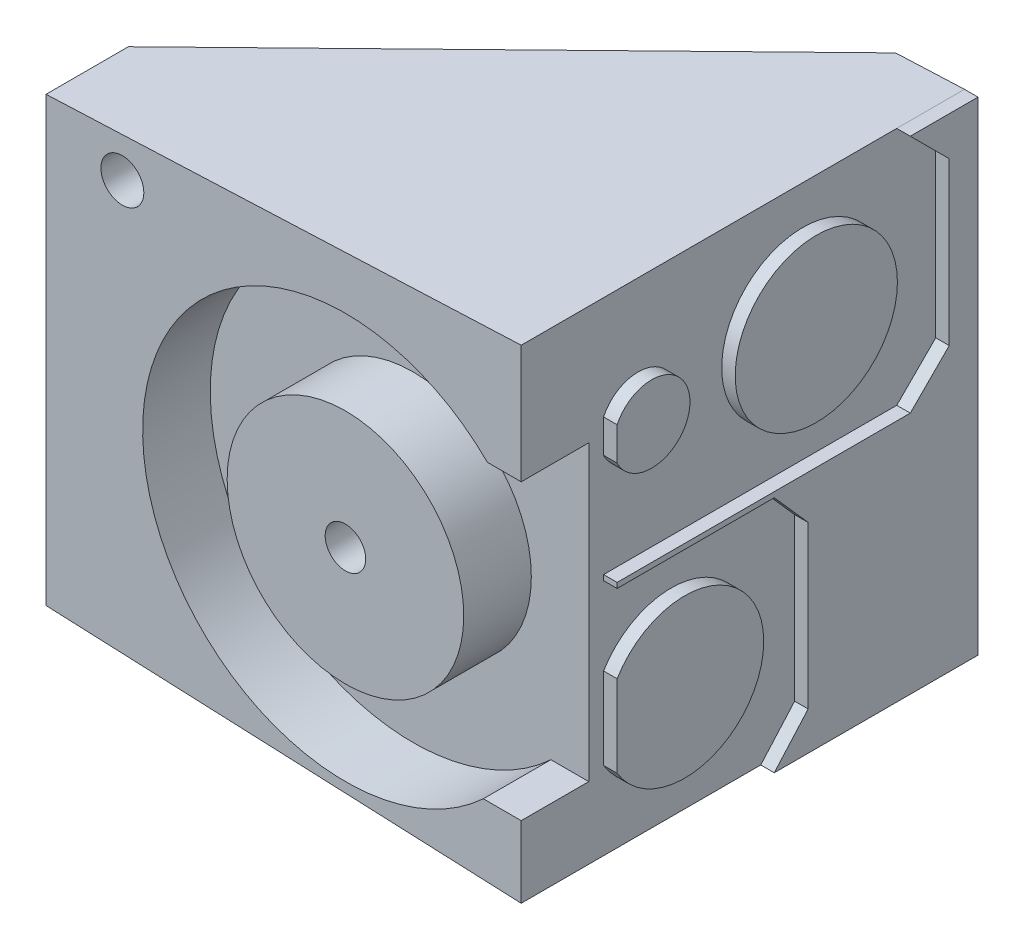
ISO-10303-21;
HEADER;
FILE_DESCRIPTION(('STEP AP214'),'2;1');
FILE_NAME('part.step','',(''),(''),'','','');
FILE_SCHEMA(('AUTOMOTIVE_DESIGN { 1 0 10303 214 1 1 1 1 }'));
ENDSEC;
DATA;
#1=APPLICATION_CONTEXT('core data for automotive mechanical design processes');
#2=APPLICATION_PROTOCOL_DEFINITION('international standard','automotive_design',2000,#1);
#3=PRODUCT_CONTEXT('',#1,'mechanical');
#4=PRODUCT('Part','Part','',(#3));
#5=PRODUCT_RELATED_PRODUCT_CATEGORY('part','',(#4));
#6=PRODUCT_DEFINITION_FORMATION('','',#4);
#7=PRODUCT_DEFINITION_CONTEXT('part definition',#1,'design');
#8=PRODUCT_DEFINITION('design','',#6,#7);
#9=PRODUCT_DEFINITION_SHAPE('','',#8);
#10=(LENGTH_UNIT() NAMED_UNIT(*) SI_UNIT(.MILLI.,.METRE.));
#11=(NAMED_UNIT(*) PLANE_ANGLE_UNIT() SI_UNIT($,.RADIAN.));
#12=(NAMED_UNIT(*) SI_UNIT($,.STERADIAN.) SOLID_ANGLE_UNIT());
#13=UNCERTAINTY_MEASURE_WITH_UNIT(LENGTH_MEASURE(1.E-05),#10,'distance_accuracy_value','');
#14=(GEOMETRIC_REPRESENTATION_CONTEXT(3) GLOBAL_UNCERTAINTY_ASSIGNED_CONTEXT((#13)) GLOBAL_UNIT_ASSIGNED_CONTEXT((#10,
#11,#12)) REPRESENTATION_CONTEXT('',''));
#15=CARTESIAN_POINT('',(0.,0.,0.));
#16=DIRECTION('',(0.,0.,1.));
#17=DIRECTION('',(1.,0.,0.));
#18=AXIS2_PLACEMENT_3D('',#15,#16,#17);
#19=CARTESIAN_POINT('',(23.958,-35.75,-32.79));
#20=DIRECTION('',(0.664090490965393,0.,0.74765220511234));
#21=DIRECTION('',(0.74765220511234,0.,-0.664090490965393));
#22=AXIS2_PLACEMENT_3D('',#19,#20,#21);
#23=PLANE('',#22);
#24=DIRECTION('',(0.,1.,0.));
#25=VECTOR('',#24,1.);
#26=CARTESIAN_POINT('',(-36.15,-35.75,20.6));
#27=LINE('',#26,#25);
#28=CARTESIAN_POINT('',(-36.15,31.,20.6));
#29=VERTEX_POINT('',#28);
#30=CARTESIAN_POINT('',(-36.15,32.75,20.6));
#31=VERTEX_POINT('',#30);
#32=EDGE_CURVE('E310',#29,#31,#27,.T.);
#33=ORIENTED_EDGE('',*,*,#32,.T.);
#34=DIRECTION('',(0.747271955042155,0.0318892726191531,-0.663752739730163));
#35=VECTOR('',#34,1.);
#36=CARTESIAN_POINT('',(22.2645224315262,35.2427961208333,-31.2857947797163));
#37=LINE('',#36,#35);
#38=CARTESIAN_POINT('',(23.958,35.3150640113798,-32.79));
#39=VERTEX_POINT('',#38);
#40=EDGE_CURVE('E287',#31,#39,#37,.T.);
#41=ORIENTED_EDGE('',*,*,#40,.T.);
#42=DIRECTION('',(0.,1.,0.));
#43=VECTOR('',#42,1.);
#44=CARTESIAN_POINT('',(23.958,-35.75,-32.79));
#45=LINE('',#44,#43);
#46=CARTESIAN_POINT('',(23.958,31.,-32.79));
#47=VERTEX_POINT('',#46);
#48=EDGE_CURVE('E259',#47,#39,#45,.T.);
#49=ORIENTED_EDGE('',*,*,#48,.F.);
#50=DIRECTION('',(-0.74765220511234,0.,0.664090490965393));
#51=VECTOR('',#50,1.);
#52=CARTESIAN_POINT('',(-36.15,31.,20.6));
#53=LINE('',#52,#51);
#54=EDGE_CURVE('E280',#47,#29,#53,.T.);
#55=ORIENTED_EDGE('',*,*,#54,.T.);
#56=EDGE_LOOP('',(#33,#41,#49,#55));
#57=FACE_BOUND('',#56,.T.);
#58=ADVANCED_FACE('F59',(#57),#23,.F.);
#59=CARTESIAN_POINT('',(36.15,35.75,32.79));
#60=DIRECTION('',(-1.,0.,0.));
#61=DIRECTION('',(0.,0.,1.));
#62=AXIS2_PLACEMENT_3D('',#59,#60,#61);
#63=PLANE('',#62);
#64=DIRECTION('',(0.,-0.707106781186548,-0.707106781186548));
#65=VECTOR('',#64,1.);
#66=CARTESIAN_POINT('',(36.15,29.26,-29.26));
#67=LINE('',#66,#65);
#68=CARTESIAN_POINT('',(36.15,35.75,-22.77));
#69=VERTEX_POINT('',#68);
#70=CARTESIAN_POINT('',(36.15,29.985,-28.535));
#71=VERTEX_POINT('',#70);
#72=EDGE_CURVE('E410',#69,#71,#67,.T.);
#73=ORIENTED_EDGE('',*,*,#72,.T.);
#74=DIRECTION('',(0.,-1.,0.));
#75=VECTOR('',#74,1.);
#76=CARTESIAN_POINT('',(36.15,0.,-28.535));
#77=LINE('',#76,#75);
#78=CARTESIAN_POINT('',(36.15,6.035,-28.535));
#79=VERTEX_POINT('',#78);
#80=EDGE_CURVE('E431',#71,#79,#77,.T.);
#81=ORIENTED_EDGE('',*,*,#80,.T.);
#82=DIRECTION('',(0.,-0.707106781186547,0.707106781186548));
#83=VECTOR('',#82,1.);
#84=CARTESIAN_POINT('',(36.15,-11.25,-11.25));
#85=LINE('',#84,#83);
#86=CARTESIAN_POINT('',(36.15,0.270000000000012,-22.77));
#87=VERTEX_POINT('',#86);
#88=EDGE_CURVE('E428',#79,#87,#85,.T.);
#89=ORIENTED_EDGE('',*,*,#88,.T.);
#90=DIRECTION('',(0.,0.,1.));
#91=VECTOR('',#90,1.);
#92=CARTESIAN_POINT('',(36.15,0.270000000000007,0.));
#93=LINE('',#92,#91);
#94=CARTESIAN_POINT('',(36.15,0.270000000000007,20.6));
#95=VERTEX_POINT('',#94);
#96=EDGE_CURVE('E425',#87,#95,#93,.T.);
#97=ORIENTED_EDGE('',*,*,#96,.T.);
#98=DIRECTION('',(0.,-1.,0.));
#99=VECTOR('',#98,1.);
#100=CARTESIAN_POINT('',(36.15,0.,20.6));
#101=LINE('',#100,#99);
#102=CARTESIAN_POINT('',(36.15,-0.509999999999999,20.6));
#103=VERTEX_POINT('',#102);
#104=EDGE_CURVE('E403',#95,#103,#101,.T.);
#105=ORIENTED_EDGE('',*,*,#104,.T.);
#106=DIRECTION('',(0.,0.,-1.));
#107=VECTOR('',#106,1.);
#108=CARTESIAN_POINT('',(36.15,-0.509999999999999,0.));
#109=LINE('',#108,#107);
#110=CARTESIAN_POINT('',(36.15,-0.509999999999999,-2.65));
#111=VERTEX_POINT('',#110);
#112=EDGE_CURVE('E422',#103,#111,#109,.T.);
#113=ORIENTED_EDGE('',*,*,#112,.T.);
#114=DIRECTION('',(0.,-0.74937483770306,-0.662146020615931));
#115=VECTOR('',#114,1.);
#116=CARTESIAN_POINT('',(36.15,1.09131520201226,-1.23508127652885));
#117=LINE('',#116,#115);
#118=CARTESIAN_POINT('',(36.15,-6.18,-7.66));
#119=VERTEX_POINT('',#118);
#120=EDGE_CURVE('E419',#111,#119,#117,.T.);
#121=ORIENTED_EDGE('',*,*,#120,.T.);
#122=DIRECTION('',(0.,-1.,0.));
#123=VECTOR('',#122,1.);
#124=CARTESIAN_POINT('',(36.15,0.,-7.66));
#125=LINE('',#124,#123);
#126=CARTESIAN_POINT('',(36.15,-30.08,-7.66));
#127=VERTEX_POINT('',#126);
#128=EDGE_CURVE('E416',#119,#127,#125,.T.);
#129=ORIENTED_EDGE('',*,*,#128,.T.);
#130=DIRECTION('',(0.,-0.74937483770306,0.662146020615931));
#131=VECTOR('',#130,1.);
#132=CARTESIAN_POINT('',(36.15,-16.9890536079233,-19.2271325263323));
#133=LINE('',#132,#131);
#134=CARTESIAN_POINT('',(36.15,-35.75,-2.65));
#135=VERTEX_POINT('',#134);
#136=EDGE_CURVE('E413',#127,#135,#133,.T.);
#137=ORIENTED_EDGE('',*,*,#136,.T.);
#138=DIRECTION('',(0.,0.,-1.));
#139=VECTOR('',#138,1.);
#140=CARTESIAN_POINT('',(36.15,-35.75,32.79));
#141=LINE('',#140,#139);
#142=CARTESIAN_POINT('',(36.15,-35.75,-32.79));
#143=VERTEX_POINT('',#142);
#144=EDGE_CURVE('E273',#135,#143,#141,.T.);
#145=ORIENTED_EDGE('',*,*,#144,.T.);
#146=DIRECTION('',(0.,-1.,0.));
#147=VECTOR('',#146,1.);
#148=CARTESIAN_POINT('',(36.15,35.75,-32.79));
#149=LINE('',#148,#147);
#150=CARTESIAN_POINT('',(36.15,35.75,-32.79));
#151=VERTEX_POINT('',#150);
#152=EDGE_CURVE('E67',#151,#143,#149,.T.);
#153=ORIENTED_EDGE('',*,*,#152,.F.);
#154=DIRECTION('',(0.,0.,-1.));
#155=VECTOR('',#154,1.);
#156=CARTESIAN_POINT('',(36.15,35.75,32.79));
#157=LINE('',#156,#155);
#158=EDGE_CURVE('E264',#69,#151,#157,.T.);
#159=ORIENTED_EDGE('',*,*,#158,.F.);
#160=EDGE_LOOP('',(#73,#81,#89,#97,#105,#113,#121,#129,#137,#145,#153,#159));
#161=FACE_BOUND('',#160,.T.);
#162=ADVANCED_FACE('F61',(#161),#63,.F.);
#163=CARTESIAN_POINT('',(-36.15,35.75,32.79));
#164=DIRECTION('',(0.,0.,-1.));
#165=DIRECTION('',(-1.,0.,0.));
#166=AXIS2_PLACEMENT_3D('',#163,#164,#165);
#167=PLANE('',#166);
#168=CARTESIAN_POINT('',(-24.8529045409058,27.3656410168728,32.79));
#169=DIRECTION('',(0.,0.,1.));
#170=DIRECTION('',(1.,0.,0.));
#171=AXIS2_PLACEMENT_3D('',#168,#169,#170);
#172=CIRCLE('',#171,3.175);
#173=CARTESIAN_POINT('',(-21.6779045409058,27.3656410168728,32.79));
#174=VERTEX_POINT('',#173);
#175=EDGE_CURVE('E281',#174,#174,#172,.T.);
#176=ORIENTED_EDGE('',*,*,#175,.F.);
#177=EDGE_LOOP('',(#176));
#178=FACE_BOUND('',#177,.T.);
#179=DIRECTION('',(0.,-1.,0.));
#180=VECTOR('',#179,1.);
#181=CARTESIAN_POINT('',(34.15,0.,32.79));
#182=LINE('',#181,#180);
#183=CARTESIAN_POINT('',(34.15,35.75,32.79));
#184=VERTEX_POINT('',#183);
#185=CARTESIAN_POINT('',(34.15,18.25,32.79));
#186=VERTEX_POINT('',#185);
#187=EDGE_CURVE('E375',#184,#186,#182,.T.);
#188=ORIENTED_EDGE('',*,*,#187,.F.);
#189=DIRECTION('',(0.999090695813441,0.0426354493234755,0.));
#190=VECTOR('',#189,1.);
#191=CARTESIAN_POINT('',(34.15,35.75,32.79));
#192=LINE('',#191,#190);
#193=CARTESIAN_POINT('',(-36.15,32.75,32.79));
#194=VERTEX_POINT('',#193);
#195=EDGE_CURVE('E260',#194,#184,#192,.T.);
#196=ORIENTED_EDGE('',*,*,#195,.F.);
#197=DIRECTION('',(0.,-1.,0.));
#198=VECTOR('',#197,1.);
#199=CARTESIAN_POINT('',(-36.15,35.75,32.79));
#200=LINE('',#199,#198);
#201=CARTESIAN_POINT('',(-36.15,-32.75,32.79));
#202=VERTEX_POINT('',#201);
#203=EDGE_CURVE('E265',#194,#202,#200,.T.);
#204=ORIENTED_EDGE('',*,*,#203,.T.);
#205=DIRECTION('',(-0.999090695813441,0.0426354493234755,0.));
#206=VECTOR('',#205,1.);
#207=CARTESIAN_POINT('',(34.15,-35.75,32.79));
#208=LINE('',#207,#206);
#209=CARTESIAN_POINT('',(34.15,-35.75,32.79));
#210=VERTEX_POINT('',#209);
#211=EDGE_CURVE('E545',#210,#202,#208,.T.);
#212=ORIENTED_EDGE('',*,*,#211,.F.);
#213=CARTESIAN_POINT('',(34.15,-25.16,32.79));
#214=VERTEX_POINT('',#213);
#215=EDGE_CURVE('E374',#214,#210,#182,.T.);
#216=ORIENTED_EDGE('',*,*,#215,.F.);
#217=DIRECTION('',(-1.,0.,0.));
#218=VECTOR('',#217,1.);
#219=CARTESIAN_POINT('',(0.,-25.16,32.79));
#220=LINE('',#219,#218);
#221=CARTESIAN_POINT('',(28.5460780543712,-25.16,32.79));
#222=VERTEX_POINT('',#221);
#223=EDGE_CURVE('E329',#214,#222,#220,.T.);
#224=ORIENTED_EDGE('',*,*,#223,.T.);
#225=CARTESIAN_POINT('',(8.15000000000001,-3.16,32.79));
#226=DIRECTION('',(0.,0.,1.));
#227=DIRECTION('',(1.,0.,0.));
#228=AXIS2_PLACEMENT_3D('',#225,#226,#227);
#229=CIRCLE('',#228,30.);
#230=CARTESIAN_POINT('',(29.1645639973805,18.25,32.79));
#231=VERTEX_POINT('',#230);
#232=EDGE_CURVE('E346',#231,#222,#229,.T.);
#233=ORIENTED_EDGE('',*,*,#232,.F.);
#234=DIRECTION('',(-1.,0.,0.));
#235=VECTOR('',#234,1.);
#236=CARTESIAN_POINT('',(0.,18.25,32.79));
#237=LINE('',#236,#235);
#238=EDGE_CURVE('E343',#186,#231,#237,.T.);
#239=ORIENTED_EDGE('',*,*,#238,.F.);
#240=EDGE_LOOP('',(#188,#196,#204,#212,#216,#224,#233,#239));
#241=FACE_BOUND('',#240,.T.);
#242=ADVANCED_FACE('F498',(#178,#241),#167,.F.);
#243=CARTESIAN_POINT('',(0.,35.75,0.));
#244=DIRECTION('',(0.,-1.,0.));
#245=DIRECTION('',(0.,0.,-1.));
#246=AXIS2_PLACEMENT_3D('',#243,#244,#245);
#247=PLANE('',#246);
#248=DIRECTION('',(-1.,0.,0.));
#249=VECTOR('',#248,1.);
#250=CARTESIAN_POINT('',(-36.15,35.75,-32.79));
#251=LINE('',#250,#249);
#252=CARTESIAN_POINT('',(34.15,35.75,-32.79));
#253=VERTEX_POINT('',#252);
#254=EDGE_CURVE('E255',#151,#253,#251,.T.);
#255=ORIENTED_EDGE('',*,*,#254,.T.);
#256=DIRECTION('',(0.,0.,1.));
#257=VECTOR('',#256,1.);
#258=CARTESIAN_POINT('',(34.15,35.75,-32.79));
#259=LINE('',#258,#257);
#260=CARTESIAN_POINT('',(34.15,35.75,-22.77));
#261=VERTEX_POINT('',#260);
#262=EDGE_CURVE('E237',#253,#261,#259,.T.);
#263=ORIENTED_EDGE('',*,*,#262,.T.);
#264=DIRECTION('',(1.,0.,0.));
#265=VECTOR('',#264,1.);
#266=CARTESIAN_POINT('',(34.15,35.75,-22.77));
#267=LINE('',#266,#265);
#268=EDGE_CURVE('E454',#261,#69,#267,.T.);
#269=ORIENTED_EDGE('',*,*,#268,.T.);
#270=ORIENTED_EDGE('',*,*,#158,.T.);
#271=EDGE_LOOP('',(#255,#263,#269,#270));
#272=FACE_BOUND('',#271,.T.);
#273=ADVANCED_FACE('F262',(#272),#247,.F.);
#274=CARTESIAN_POINT('',(0.,-35.75,0.));
#275=DIRECTION('',(0.,-1.,0.));
#276=DIRECTION('',(0.,0.,-1.));
#277=AXIS2_PLACEMENT_3D('',#274,#275,#276);
#278=PLANE('',#277);
#279=DIRECTION('',(0.,0.,1.));
#280=VECTOR('',#279,1.);
#281=CARTESIAN_POINT('',(34.15,-35.75,-32.79));
#282=LINE('',#281,#280);
#283=CARTESIAN_POINT('',(34.15,-35.75,-32.79));
#284=VERTEX_POINT('',#283);
#285=CARTESIAN_POINT('',(34.15,-35.75,-2.65));
#286=VERTEX_POINT('',#285);
#287=EDGE_CURVE('E547',#284,#286,#282,.T.);
#288=ORIENTED_EDGE('',*,*,#287,.F.);
#289=DIRECTION('',(-1.,0.,0.));
#290=VECTOR('',#289,1.);
#291=CARTESIAN_POINT('',(-36.15,-35.75,-32.79));
#292=LINE('',#291,#290);
#293=EDGE_CURVE('E269',#143,#284,#292,.T.);
#294=ORIENTED_EDGE('',*,*,#293,.F.);
#295=ORIENTED_EDGE('',*,*,#144,.F.);
#296=DIRECTION('',(1.,0.,0.));
#297=VECTOR('',#296,1.);
#298=CARTESIAN_POINT('',(34.15,-35.75,-2.65));
#299=LINE('',#298,#297);
#300=EDGE_CURVE('E452',#286,#135,#299,.T.);
#301=ORIENTED_EDGE('',*,*,#300,.F.);
#302=EDGE_LOOP('',(#288,#294,#295,#301));
#303=FACE_BOUND('',#302,.T.);
#304=ADVANCED_FACE('F568',(#303),#278,.T.);
#305=CARTESIAN_POINT('',(-36.15,35.75,-32.79));
#306=DIRECTION('',(0.,0.,1.));
#307=DIRECTION('',(1.,0.,0.));
#308=AXIS2_PLACEMENT_3D('',#305,#306,#307);
#309=PLANE('',#308);
#310=ORIENTED_EDGE('',*,*,#48,.T.);
#311=DIRECTION('',(0.999090695813441,0.0426354493234755,0.));
#312=VECTOR('',#311,1.);
#313=CARTESIAN_POINT('',(34.15,35.75,-32.79));
#314=LINE('',#313,#312);
#315=EDGE_CURVE('E240',#39,#253,#314,.T.);
#316=ORIENTED_EDGE('',*,*,#315,.T.);
#317=ORIENTED_EDGE('',*,*,#254,.F.);
#318=ORIENTED_EDGE('',*,*,#152,.T.);
#319=ORIENTED_EDGE('',*,*,#293,.T.);
#320=DIRECTION('',(-0.999090695813441,0.0426354493234755,0.));
#321=VECTOR('',#320,1.);
#322=CARTESIAN_POINT('',(34.15,-35.75,-32.79));
#323=LINE('',#322,#321);
#324=CARTESIAN_POINT('',(23.958,-35.3150640113798,-32.79));
#325=VERTEX_POINT('',#324);
#326=EDGE_CURVE('E527',#284,#325,#323,.T.);
#327=ORIENTED_EDGE('',*,*,#326,.T.);
#328=CARTESIAN_POINT('',(23.958,-31.,-32.79));
#329=VERTEX_POINT('',#328);
#330=EDGE_CURVE('E314',#325,#329,#45,.T.);
#331=ORIENTED_EDGE('',*,*,#330,.T.);
#332=DIRECTION('',(0.,1.,0.));
#333=VECTOR('',#332,1.);
#334=CARTESIAN_POINT('',(23.958,-31.,-32.79));
#335=LINE('',#334,#333);
#336=EDGE_CURVE('E308',#329,#47,#335,.T.);
#337=ORIENTED_EDGE('',*,*,#336,.T.);
#338=EDGE_LOOP('',(#310,#316,#317,#318,#319,#327,#331,#337));
#339=FACE_BOUND('',#338,.T.);
#340=ADVANCED_FACE('F253',(#339),#309,.F.);
#341=CARTESIAN_POINT('',(-36.15,35.75,32.79));
#342=DIRECTION('',(1.,0.,0.));
#343=DIRECTION('',(0.,0.,-1.));
#344=AXIS2_PLACEMENT_3D('',#341,#342,#343);
#345=PLANE('',#344);
#346=ORIENTED_EDGE('',*,*,#203,.F.);
#347=DIRECTION('',(0.,0.,1.));
#348=VECTOR('',#347,1.);
#349=CARTESIAN_POINT('',(-36.15,32.75,-32.79));
#350=LINE('',#349,#348);
#351=EDGE_CURVE('E248',#31,#194,#350,.T.);
#352=ORIENTED_EDGE('',*,*,#351,.F.);
#353=ORIENTED_EDGE('',*,*,#32,.F.);
#354=DIRECTION('',(0.,1.,0.));
#355=VECTOR('',#354,1.);
#356=CARTESIAN_POINT('',(-36.15,-31.,20.6));
#357=LINE('',#356,#355);
#358=CARTESIAN_POINT('',(-36.15,-31.,20.6));
#359=VERTEX_POINT('',#358);
#360=EDGE_CURVE('E303',#359,#29,#357,.T.);
#361=ORIENTED_EDGE('',*,*,#360,.F.);
#362=CARTESIAN_POINT('',(-36.15,-32.75,20.6));
#363=VERTEX_POINT('',#362);
#364=EDGE_CURVE('E317',#363,#359,#27,.T.);
#365=ORIENTED_EDGE('',*,*,#364,.F.);
#366=DIRECTION('',(0.,0.,1.));
#367=VECTOR('',#366,1.);
#368=CARTESIAN_POINT('',(-36.15,-32.75,-32.79));
#369=LINE('',#368,#367);
#370=EDGE_CURVE('E74',#363,#202,#369,.T.);
#371=ORIENTED_EDGE('',*,*,#370,.T.);
#372=EDGE_LOOP('',(#346,#352,#353,#361,#365,#371));
#373=FACE_BOUND('',#372,.T.);
#374=ADVANCED_FACE('F539',(#373),#345,.F.);
#375=CARTESIAN_POINT('',(34.15,29.26,-29.26));
#376=DIRECTION('',(0.,-0.707106781186547,0.707106781186547));
#377=DIRECTION('',(0.,-0.707106781186548,-0.707106781186548));
#378=AXIS2_PLACEMENT_3D('',#375,#376,#377);
#379=PLANE('',#378);
#380=ORIENTED_EDGE('',*,*,#72,.F.);
#381=ORIENTED_EDGE('',*,*,#268,.F.);
#382=DIRECTION('',(0.,-0.707106781186548,-0.707106781186548));
#383=VECTOR('',#382,1.);
#384=CARTESIAN_POINT('',(34.15,29.26,-29.26));
#385=LINE('',#384,#383);
#386=CARTESIAN_POINT('',(34.15,29.985,-28.535));
#387=VERTEX_POINT('',#386);
#388=EDGE_CURVE('E370',#261,#387,#385,.T.);
#389=ORIENTED_EDGE('',*,*,#388,.T.);
#390=DIRECTION('',(1.,0.,0.));
#391=VECTOR('',#390,1.);
#392=CARTESIAN_POINT('',(34.15,29.985,-28.535));
#393=LINE('',#392,#391);
#394=EDGE_CURVE('E275',#387,#71,#393,.T.);
#395=ORIENTED_EDGE('',*,*,#394,.T.);
#396=EDGE_LOOP('',(#380,#381,#389,#395));
#397=FACE_BOUND('',#396,.T.);
#398=ADVANCED_FACE('F559',(#397),#379,.T.);
#399=CARTESIAN_POINT('',(34.15,0.,-28.535));
#400=DIRECTION('',(0.,0.,1.));
#401=DIRECTION('',(1.,0.,0.));
#402=AXIS2_PLACEMENT_3D('',#399,#400,#401);
#403=PLANE('',#402);
#404=ORIENTED_EDGE('',*,*,#80,.F.);
#405=ORIENTED_EDGE('',*,*,#394,.F.);
#406=DIRECTION('',(0.,-1.,0.));
#407=VECTOR('',#406,1.);
#408=CARTESIAN_POINT('',(34.15,0.,-28.535));
#409=LINE('',#408,#407);
#410=CARTESIAN_POINT('',(34.15,6.035,-28.535));
#411=VERTEX_POINT('',#410);
#412=EDGE_CURVE('E394',#387,#411,#409,.T.);
#413=ORIENTED_EDGE('',*,*,#412,.T.);
#414=DIRECTION('',(1.,0.,0.));
#415=VECTOR('',#414,1.);
#416=CARTESIAN_POINT('',(34.15,6.035,-28.535));
#417=LINE('',#416,#415);
#418=EDGE_CURVE('E438',#411,#79,#417,.T.);
#419=ORIENTED_EDGE('',*,*,#418,.T.);
#420=EDGE_LOOP('',(#404,#405,#413,#419));
#421=FACE_BOUND('',#420,.T.);
#422=ADVANCED_FACE('F561',(#421),#403,.T.);
#423=CARTESIAN_POINT('',(34.15,-11.25,-11.25));
#424=DIRECTION('',(0.,0.707106781186548,0.707106781186547));
#425=DIRECTION('',(0.,-0.707106781186547,0.707106781186548));
#426=AXIS2_PLACEMENT_3D('',#423,#424,#425);
#427=PLANE('',#426);
#428=ORIENTED_EDGE('',*,*,#88,.F.);
#429=ORIENTED_EDGE('',*,*,#418,.F.);
#430=DIRECTION('',(0.,-0.707106781186547,0.707106781186548));
#431=VECTOR('',#430,1.);
#432=CARTESIAN_POINT('',(34.15,-11.25,-11.25));
#433=LINE('',#432,#431);
#434=CARTESIAN_POINT('',(34.15,0.270000000000012,-22.77));
#435=VERTEX_POINT('',#434);
#436=EDGE_CURVE('E392',#411,#435,#433,.T.);
#437=ORIENTED_EDGE('',*,*,#436,.T.);
#438=DIRECTION('',(1.,0.,0.));
#439=VECTOR('',#438,1.);
#440=CARTESIAN_POINT('',(34.15,0.270000000000012,-22.77));
#441=LINE('',#440,#439);
#442=EDGE_CURVE('E440',#435,#87,#441,.T.);
#443=ORIENTED_EDGE('',*,*,#442,.T.);
#444=EDGE_LOOP('',(#428,#429,#437,#443));
#445=FACE_BOUND('',#444,.T.);
#446=ADVANCED_FACE('F614',(#445),#427,.T.);
#447=CARTESIAN_POINT('',(34.15,0.270000000000007,0.));
#448=DIRECTION('',(0.,1.,0.));
#449=DIRECTION('',(0.,0.,1.));
#450=AXIS2_PLACEMENT_3D('',#447,#448,#449);
#451=PLANE('',#450);
#452=ORIENTED_EDGE('',*,*,#96,.F.);
#453=ORIENTED_EDGE('',*,*,#442,.F.);
#454=DIRECTION('',(0.,0.,1.));
#455=VECTOR('',#454,1.);
#456=CARTESIAN_POINT('',(34.15,0.270000000000007,0.));
#457=LINE('',#456,#455);
#458=CARTESIAN_POINT('',(34.15,0.270000000000007,20.6));
#459=VERTEX_POINT('',#458);
#460=EDGE_CURVE('E390',#435,#459,#457,.T.);
#461=ORIENTED_EDGE('',*,*,#460,.T.);
#462=DIRECTION('',(1.,0.,0.));
#463=VECTOR('',#462,1.);
#464=CARTESIAN_POINT('',(34.15,0.270000000000007,20.6));
#465=LINE('',#464,#463);
#466=EDGE_CURVE('E442',#459,#95,#465,.T.);
#467=ORIENTED_EDGE('',*,*,#466,.T.);
#468=EDGE_LOOP('',(#452,#453,#461,#467));
#469=FACE_BOUND('',#468,.T.);
#470=ADVANCED_FACE('F617',(#469),#451,.T.);
#471=CARTESIAN_POINT('',(34.15,0.,20.6));
#472=DIRECTION('',(0.,0.,1.));
#473=DIRECTION('',(0.,-1.,0.));
#474=AXIS2_PLACEMENT_3D('',#471,#472,#473);
#475=PLANE('',#474);
#476=ORIENTED_EDGE('',*,*,#104,.F.);
#477=ORIENTED_EDGE('',*,*,#466,.F.);
#478=DIRECTION('',(0.,-1.,0.));
#479=VECTOR('',#478,1.);
#480=CARTESIAN_POINT('',(34.15,0.,20.6));
#481=LINE('',#480,#479);
#482=CARTESIAN_POINT('',(34.15,-0.509999999999999,20.6));
#483=VERTEX_POINT('',#482);
#484=EDGE_CURVE('E365',#459,#483,#481,.T.);
#485=ORIENTED_EDGE('',*,*,#484,.T.);
#486=DIRECTION('',(1.,0.,0.));
#487=VECTOR('',#486,1.);
#488=CARTESIAN_POINT('',(34.15,-0.509999999999999,20.6));
#489=LINE('',#488,#487);
#490=EDGE_CURVE('E444',#483,#103,#489,.T.);
#491=ORIENTED_EDGE('',*,*,#490,.T.);
#492=EDGE_LOOP('',(#476,#477,#485,#491));
#493=FACE_BOUND('',#492,.T.);
#494=ADVANCED_FACE('F621',(#493),#475,.T.);
#495=CARTESIAN_POINT('',(34.15,-0.509999999999999,0.));
#496=DIRECTION('',(0.,-1.,0.));
#497=DIRECTION('',(0.,0.,-1.));
#498=AXIS2_PLACEMENT_3D('',#495,#496,#497);
#499=PLANE('',#498);
#500=ORIENTED_EDGE('',*,*,#112,.F.);
#501=ORIENTED_EDGE('',*,*,#490,.F.);
#502=DIRECTION('',(0.,0.,-1.));
#503=VECTOR('',#502,1.);
#504=CARTESIAN_POINT('',(34.15,-0.509999999999999,0.));
#505=LINE('',#504,#503);
#506=CARTESIAN_POINT('',(34.15,-0.509999999999999,-2.65));
#507=VERTEX_POINT('',#506);
#508=EDGE_CURVE('E388',#483,#507,#505,.T.);
#509=ORIENTED_EDGE('',*,*,#508,.T.);
#510=DIRECTION('',(1.,0.,0.));
#511=VECTOR('',#510,1.);
#512=CARTESIAN_POINT('',(34.15,-0.509999999999999,-2.65));
#513=LINE('',#512,#511);
#514=EDGE_CURVE('E446',#507,#111,#513,.T.);
#515=ORIENTED_EDGE('',*,*,#514,.T.);
#516=EDGE_LOOP('',(#500,#501,#509,#515));
#517=FACE_BOUND('',#516,.T.);
#518=ADVANCED_FACE('F625',(#517),#499,.T.);
#519=CARTESIAN_POINT('',(34.15,1.09131520201226,-1.23508127652885));
#520=DIRECTION('',(0.,-0.662146020615931,0.74937483770306));
#521=DIRECTION('',(0.,-0.74937483770306,-0.662146020615931));
#522=AXIS2_PLACEMENT_3D('',#519,#520,#521);
#523=PLANE('',#522);
#524=ORIENTED_EDGE('',*,*,#120,.F.);
#525=ORIENTED_EDGE('',*,*,#514,.F.);
#526=DIRECTION('',(0.,-0.74937483770306,-0.662146020615931));
#527=VECTOR('',#526,1.);
#528=CARTESIAN_POINT('',(34.15,1.09131520201226,-1.23508127652885));
#529=LINE('',#528,#527);
#530=CARTESIAN_POINT('',(34.15,-6.18,-7.66));
#531=VERTEX_POINT('',#530);
#532=EDGE_CURVE('E386',#507,#531,#529,.T.);
#533=ORIENTED_EDGE('',*,*,#532,.T.);
#534=DIRECTION('',(1.,0.,0.));
#535=VECTOR('',#534,1.);
#536=CARTESIAN_POINT('',(34.15,-6.18,-7.66));
#537=LINE('',#536,#535);
#538=EDGE_CURVE('E448',#531,#119,#537,.T.);
#539=ORIENTED_EDGE('',*,*,#538,.T.);
#540=EDGE_LOOP('',(#524,#525,#533,#539));
#541=FACE_BOUND('',#540,.T.);
#542=ADVANCED_FACE('F630',(#541),#523,.T.);
#543=CARTESIAN_POINT('',(34.15,0.,-7.66));
#544=DIRECTION('',(0.,0.,1.));
#545=DIRECTION('',(1.,0.,0.));
#546=AXIS2_PLACEMENT_3D('',#543,#544,#545);
#547=PLANE('',#546);
#548=ORIENTED_EDGE('',*,*,#128,.F.);
#549=ORIENTED_EDGE('',*,*,#538,.F.);
#550=DIRECTION('',(0.,-1.,0.));
#551=VECTOR('',#550,1.);
#552=CARTESIAN_POINT('',(34.15,0.,-7.66));
#553=LINE('',#552,#551);
#554=CARTESIAN_POINT('',(34.15,-30.08,-7.66));
#555=VERTEX_POINT('',#554);
#556=EDGE_CURVE('E384',#531,#555,#553,.T.);
#557=ORIENTED_EDGE('',*,*,#556,.T.);
#558=DIRECTION('',(1.,0.,0.));
#559=VECTOR('',#558,1.);
#560=CARTESIAN_POINT('',(34.15,-30.08,-7.66));
#561=LINE('',#560,#559);
#562=EDGE_CURVE('E450',#555,#127,#561,.T.);
#563=ORIENTED_EDGE('',*,*,#562,.T.);
#564=EDGE_LOOP('',(#548,#549,#557,#563));
#565=FACE_BOUND('',#564,.T.);
#566=ADVANCED_FACE('F634',(#565),#547,.T.);
#567=CARTESIAN_POINT('',(34.15,-16.9890536079233,-19.2271325263323));
#568=DIRECTION('',(0.,0.662146020615931,0.74937483770306));
#569=DIRECTION('',(0.,-0.74937483770306,0.662146020615931));
#570=AXIS2_PLACEMENT_3D('',#567,#568,#569);
#571=PLANE('',#570);
#572=ORIENTED_EDGE('',*,*,#136,.F.);
#573=ORIENTED_EDGE('',*,*,#562,.F.);
#574=DIRECTION('',(0.,-0.74937483770306,0.662146020615931));
#575=VECTOR('',#574,1.);
#576=CARTESIAN_POINT('',(34.15,-16.9890536079233,-19.2271325263323));
#577=LINE('',#576,#575);
#578=EDGE_CURVE('E381',#555,#286,#577,.T.);
#579=ORIENTED_EDGE('',*,*,#578,.T.);
#580=ORIENTED_EDGE('',*,*,#300,.T.);
#581=EDGE_LOOP('',(#572,#573,#579,#580));
#582=FACE_BOUND('',#581,.T.);
#583=ADVANCED_FACE('F575',(#582),#571,.T.);
#584=CARTESIAN_POINT('',(36.15,-12.0755718684586,20.6));
#585=VERTEX_POINT('',#584);
#586=CARTESIAN_POINT('',(36.15,-24.1844281315414,20.6));
#587=VERTEX_POINT('',#586);
#588=EDGE_CURVE('E404',#585,#587,#101,.T.);
#589=ORIENTED_EDGE('',*,*,#588,.F.);
#590=DIRECTION('',(1.,0.,0.));
#591=VECTOR('',#590,1.);
#592=CARTESIAN_POINT('',(34.15,-12.0755718684586,20.6));
#593=LINE('',#592,#591);
#594=CARTESIAN_POINT('',(34.15,-12.0755718684586,20.6));
#595=VERTEX_POINT('',#594);
#596=EDGE_CURVE('E459',#595,#585,#593,.T.);
#597=ORIENTED_EDGE('',*,*,#596,.F.);
#598=CARTESIAN_POINT('',(34.15,-24.1844281315414,20.6));
#599=VERTEX_POINT('',#598);
#600=EDGE_CURVE('E366',#595,#599,#481,.T.);
#601=ORIENTED_EDGE('',*,*,#600,.T.);
#602=DIRECTION('',(1.,0.,0.));
#603=VECTOR('',#602,1.);
#604=CARTESIAN_POINT('',(34.15,-24.1844281315414,20.6));
#605=LINE('',#604,#603);
#606=EDGE_CURVE('E456',#599,#587,#605,.T.);
#607=ORIENTED_EDGE('',*,*,#606,.T.);
#608=EDGE_LOOP('',(#589,#597,#601,#607));
#609=FACE_BOUND('',#608,.T.);
#610=ADVANCED_FACE('F627',(#609),#475,.T.);
#611=CARTESIAN_POINT('',(36.15,20.4669900284698,20.6));
#612=VERTEX_POINT('',#611);
#613=CARTESIAN_POINT('',(36.15,15.5530099715302,20.6));
#614=VERTEX_POINT('',#613);
#615=EDGE_CURVE('E353',#612,#614,#101,.T.);
#616=ORIENTED_EDGE('',*,*,#615,.F.);
#617=DIRECTION('',(1.,0.,0.));
#618=VECTOR('',#617,1.);
#619=CARTESIAN_POINT('',(34.15,20.4669900284698,20.6));
#620=LINE('',#619,#618);
#621=CARTESIAN_POINT('',(34.15,20.4669900284698,20.6));
#622=VERTEX_POINT('',#621);
#623=EDGE_CURVE('E399',#622,#612,#620,.T.);
#624=ORIENTED_EDGE('',*,*,#623,.F.);
#625=CARTESIAN_POINT('',(34.15,15.5530099715302,20.6));
#626=VERTEX_POINT('',#625);
#627=EDGE_CURVE('E360',#622,#626,#481,.T.);
#628=ORIENTED_EDGE('',*,*,#627,.T.);
#629=DIRECTION('',(1.,0.,0.));
#630=VECTOR('',#629,1.);
#631=CARTESIAN_POINT('',(34.15,15.5530099715302,20.6));
#632=LINE('',#631,#630);
#633=EDGE_CURVE('E462',#626,#614,#632,.T.);
#634=ORIENTED_EDGE('',*,*,#633,.T.);
#635=EDGE_LOOP('',(#616,#624,#628,#634));
#636=FACE_BOUND('',#635,.T.);
#637=ADVANCED_FACE('F473',(#636),#475,.T.);
#638=CARTESIAN_POINT('',(34.15,-18.13,10.6));
#639=DIRECTION('',(1.,0.,0.));
#640=DIRECTION('',(0.,0.,-1.));
#641=AXIS2_PLACEMENT_3D('',#638,#639,#640);
#642=CYLINDRICAL_SURFACE('',#641,11.69);
#643=CARTESIAN_POINT('',(36.15,-18.13,10.6));
#644=DIRECTION('',(1.,0.,0.));
#645=DIRECTION('',(0.,0.,-1.));
#646=AXIS2_PLACEMENT_3D('',#643,#644,#645);
#647=CIRCLE('',#646,11.69);
#648=EDGE_CURVE('E407',#587,#585,#647,.T.);
#649=ORIENTED_EDGE('',*,*,#648,.F.);
#650=ORIENTED_EDGE('',*,*,#606,.F.);
#651=CARTESIAN_POINT('',(34.15,-18.13,10.6));
#652=DIRECTION('',(1.,0.,0.));
#653=DIRECTION('',(0.,0.,-1.));
#654=AXIS2_PLACEMENT_3D('',#651,#652,#653);
#655=CIRCLE('',#654,11.69);
#656=EDGE_CURVE('E368',#599,#595,#655,.T.);
#657=ORIENTED_EDGE('',*,*,#656,.T.);
#658=ORIENTED_EDGE('',*,*,#596,.T.);
#659=EDGE_LOOP('',(#649,#650,#657,#658));
#660=FACE_BOUND('',#659,.T.);
#661=ADVANCED_FACE('F643',(#660),#642,.T.);
#662=CARTESIAN_POINT('',(34.15,18.01,15.49));
#663=DIRECTION('',(1.,0.,0.));
#664=DIRECTION('',(0.,0.,-1.));
#665=AXIS2_PLACEMENT_3D('',#662,#663,#664);
#666=CYLINDRICAL_SURFACE('',#665,5.67);
#667=CARTESIAN_POINT('',(36.15,18.01,15.49));
#668=DIRECTION('',(1.,0.,0.));
#669=DIRECTION('',(0.,0.,-1.));
#670=AXIS2_PLACEMENT_3D('',#667,#668,#669);
#671=CIRCLE('',#670,5.67);
#672=EDGE_CURVE('E402',#614,#612,#671,.T.);
#673=ORIENTED_EDGE('',*,*,#672,.F.);
#674=ORIENTED_EDGE('',*,*,#633,.F.);
#675=CARTESIAN_POINT('',(34.15,18.01,15.49));
#676=DIRECTION('',(1.,0.,0.));
#677=DIRECTION('',(0.,0.,-1.));
#678=AXIS2_PLACEMENT_3D('',#675,#676,#677);
#679=CIRCLE('',#678,5.67);
#680=EDGE_CURVE('E363',#626,#622,#679,.T.);
#681=ORIENTED_EDGE('',*,*,#680,.T.);
#682=ORIENTED_EDGE('',*,*,#623,.T.);
#683=EDGE_LOOP('',(#673,#674,#681,#682));
#684=FACE_BOUND('',#683,.T.);
#685=ADVANCED_FACE('F467',(#684),#666,.T.);
#686=CARTESIAN_POINT('',(34.15,18.01,-8.87));
#687=DIRECTION('',(1.,0.,0.));
#688=DIRECTION('',(0.,0.,-1.));
#689=AXIS2_PLACEMENT_3D('',#686,#687,#688);
#690=CYLINDRICAL_SURFACE('',#689,12.);
#691=CARTESIAN_POINT('',(34.15,18.01,-8.87));
#692=DIRECTION('',(1.,0.,0.));
#693=DIRECTION('',(0.,0.,-1.));
#694=AXIS2_PLACEMENT_3D('',#691,#692,#693);
#695=CIRCLE('',#694,12.);
#696=CARTESIAN_POINT('',(34.15,18.01,-20.87));
#697=VERTEX_POINT('',#696);
#698=EDGE_CURVE('E396',#697,#697,#695,.T.);
#699=ORIENTED_EDGE('',*,*,#698,.T.);
#700=EDGE_LOOP('',(#699));
#701=FACE_BOUND('',#700,.T.);
#702=CARTESIAN_POINT('',(36.15,18.01,-8.87));
#703=DIRECTION('',(1.,0.,0.));
#704=DIRECTION('',(0.,0.,-1.));
#705=AXIS2_PLACEMENT_3D('',#702,#703,#704);
#706=CIRCLE('',#705,12.);
#707=CARTESIAN_POINT('',(36.15,18.01,-20.87));
#708=VERTEX_POINT('',#707);
#709=EDGE_CURVE('E364',#708,#708,#706,.T.);
#710=ORIENTED_EDGE('',*,*,#709,.F.);
#711=EDGE_LOOP('',(#710));
#712=FACE_BOUND('',#711,.T.);
#713=ADVANCED_FACE('F479',(#701,#712),#690,.T.);
#714=CARTESIAN_POINT('',(34.15,0.,0.));
#715=DIRECTION('',(1.,0.,0.));
#716=DIRECTION('',(0.,0.,-1.));
#717=AXIS2_PLACEMENT_3D('',#714,#715,#716);
#718=PLANE('',#717);
#719=DIRECTION('',(0.,0.,1.));
#720=VECTOR('',#719,1.);
#721=CARTESIAN_POINT('',(34.15,18.25,22.79));
#722=LINE('',#721,#720);
#723=CARTESIAN_POINT('',(34.15,18.25,22.79));
#724=VERTEX_POINT('',#723);
#725=EDGE_CURVE('E351',#724,#186,#722,.T.);
#726=ORIENTED_EDGE('',*,*,#725,.F.);
#727=DIRECTION('',(0.,1.,0.));
#728=VECTOR('',#727,1.);
#729=CARTESIAN_POINT('',(34.15,0.,22.79));
#730=LINE('',#729,#728);
#731=CARTESIAN_POINT('',(34.15,-25.16,22.79));
#732=VERTEX_POINT('',#731);
#733=EDGE_CURVE('E337',#732,#724,#730,.T.);
#734=ORIENTED_EDGE('',*,*,#733,.F.);
#735=DIRECTION('',(0.,0.,1.));
#736=VECTOR('',#735,1.);
#737=CARTESIAN_POINT('',(34.15,-25.16,22.79));
#738=LINE('',#737,#736);
#739=EDGE_CURVE('E354',#732,#214,#738,.T.);
#740=ORIENTED_EDGE('',*,*,#739,.T.);
#741=ORIENTED_EDGE('',*,*,#215,.T.);
#742=DIRECTION('',(0.,0.,-1.));
#743=VECTOR('',#742,1.);
#744=CARTESIAN_POINT('',(34.15,-35.75,0.));
#745=LINE('',#744,#743);
#746=EDGE_CURVE('E378',#210,#286,#745,.T.);
#747=ORIENTED_EDGE('',*,*,#746,.T.);
#748=ORIENTED_EDGE('',*,*,#578,.F.);
#749=ORIENTED_EDGE('',*,*,#556,.F.);
#750=ORIENTED_EDGE('',*,*,#532,.F.);
#751=ORIENTED_EDGE('',*,*,#508,.F.);
#752=ORIENTED_EDGE('',*,*,#484,.F.);
#753=ORIENTED_EDGE('',*,*,#460,.F.);
#754=ORIENTED_EDGE('',*,*,#436,.F.);
#755=ORIENTED_EDGE('',*,*,#412,.F.);
#756=ORIENTED_EDGE('',*,*,#388,.F.);
#757=DIRECTION('',(0.,0.,1.));
#758=VECTOR('',#757,1.);
#759=CARTESIAN_POINT('',(34.15,35.75,0.));
#760=LINE('',#759,#758);
#761=EDGE_CURVE('E243',#261,#184,#760,.T.);
#762=ORIENTED_EDGE('',*,*,#761,.T.);
#763=ORIENTED_EDGE('',*,*,#187,.T.);
#764=EDGE_LOOP('',(#726,#734,#740,#741,#747,#748,#749,#750,#751,#752,#753,#754,#755,#756,#762,#763));
#765=FACE_BOUND('',#764,.T.);
#766=ORIENTED_EDGE('',*,*,#627,.F.);
#767=ORIENTED_EDGE('',*,*,#680,.F.);
#768=EDGE_LOOP('',(#766,#767));
#769=FACE_BOUND('',#768,.T.);
#770=ORIENTED_EDGE('',*,*,#600,.F.);
#771=ORIENTED_EDGE('',*,*,#656,.F.);
#772=EDGE_LOOP('',(#770,#771));
#773=FACE_BOUND('',#772,.T.);
#774=ORIENTED_EDGE('',*,*,#698,.F.);
#775=EDGE_LOOP('',(#774));
#776=FACE_BOUND('',#775,.T.);
#777=ADVANCED_FACE('F475',(#765,#769,#773,#776),#718,.T.);
#778=ORIENTED_EDGE('',*,*,#709,.T.);
#779=EDGE_LOOP('',(#778));
#780=FACE_BOUND('',#779,.T.);
#781=ADVANCED_FACE('F478',(#780),#63,.F.);
#782=ORIENTED_EDGE('',*,*,#615,.T.);
#783=ORIENTED_EDGE('',*,*,#672,.T.);
#784=EDGE_LOOP('',(#782,#783));
#785=FACE_BOUND('',#784,.T.);
#786=ADVANCED_FACE('F472',(#785),#63,.F.);
#787=ORIENTED_EDGE('',*,*,#588,.T.);
#788=ORIENTED_EDGE('',*,*,#648,.T.);
#789=EDGE_LOOP('',(#787,#788));
#790=FACE_BOUND('',#789,.T.);
#791=ADVANCED_FACE('F496',(#790),#63,.F.);
#792=CARTESIAN_POINT('',(0.,18.25,22.79));
#793=DIRECTION('',(0.,1.,0.));
#794=DIRECTION('',(0.,0.,1.));
#795=AXIS2_PLACEMENT_3D('',#792,#793,#794);
#796=PLANE('',#795);
#797=ORIENTED_EDGE('',*,*,#238,.T.);
#798=DIRECTION('',(0.,0.,1.));
#799=VECTOR('',#798,1.);
#800=CARTESIAN_POINT('',(29.1645639973805,18.25,22.79));
#801=LINE('',#800,#799);
#802=CARTESIAN_POINT('',(29.1645639973805,18.25,22.79));
#803=VERTEX_POINT('',#802);
#804=EDGE_CURVE('E340',#803,#231,#801,.T.);
#805=ORIENTED_EDGE('',*,*,#804,.F.);
#806=DIRECTION('',(-1.,0.,0.));
#807=VECTOR('',#806,1.);
#808=CARTESIAN_POINT('',(0.,18.25,22.79));
#809=LINE('',#808,#807);
#810=EDGE_CURVE('E328',#724,#803,#809,.T.);
#811=ORIENTED_EDGE('',*,*,#810,.F.);
#812=ORIENTED_EDGE('',*,*,#725,.T.);
#813=EDGE_LOOP('',(#797,#805,#811,#812));
#814=FACE_BOUND('',#813,.T.);
#815=ADVANCED_FACE('F587',(#814),#796,.F.);
#816=CARTESIAN_POINT('',(0.,-25.16,22.79));
#817=DIRECTION('',(0.,1.,0.));
#818=DIRECTION('',(0.,0.,1.));
#819=AXIS2_PLACEMENT_3D('',#816,#817,#818);
#820=PLANE('',#819);
#821=ORIENTED_EDGE('',*,*,#223,.F.);
#822=ORIENTED_EDGE('',*,*,#739,.F.);
#823=DIRECTION('',(-1.,0.,0.));
#824=VECTOR('',#823,1.);
#825=CARTESIAN_POINT('',(0.,-25.16,22.79));
#826=LINE('',#825,#824);
#827=CARTESIAN_POINT('',(28.5460780543712,-25.16,22.79));
#828=VERTEX_POINT('',#827);
#829=EDGE_CURVE('E335',#732,#828,#826,.T.);
#830=ORIENTED_EDGE('',*,*,#829,.T.);
#831=DIRECTION('',(0.,0.,1.));
#832=VECTOR('',#831,1.);
#833=CARTESIAN_POINT('',(28.5460780543712,-25.16,22.79));
#834=LINE('',#833,#832);
#835=EDGE_CURVE('E357',#828,#222,#834,.T.);
#836=ORIENTED_EDGE('',*,*,#835,.T.);
#837=EDGE_LOOP('',(#821,#822,#830,#836));
#838=FACE_BOUND('',#837,.T.);
#839=ADVANCED_FACE('F581',(#838),#820,.T.);
#840=CARTESIAN_POINT('',(8.15000000000001,-3.16,22.79));
#841=DIRECTION('',(0.,0.,1.));
#842=DIRECTION('',(1.,0.,0.));
#843=AXIS2_PLACEMENT_3D('',#840,#841,#842);
#844=CYLINDRICAL_SURFACE('',#843,17.5);
#845=CARTESIAN_POINT('',(8.15000000000001,-3.16,22.79));
#846=DIRECTION('',(0.,0.,1.));
#847=DIRECTION('',(1.,0.,0.));
#848=AXIS2_PLACEMENT_3D('',#845,#846,#847);
#849=CIRCLE('',#848,17.5);
#850=CARTESIAN_POINT('',(25.65,-3.16,22.79));
#851=VERTEX_POINT('',#850);
#852=EDGE_CURVE('E325',#851,#851,#849,.T.);
#853=ORIENTED_EDGE('',*,*,#852,.T.);
#854=EDGE_LOOP('',(#853));
#855=FACE_BOUND('',#854,.T.);
#856=CARTESIAN_POINT('',(8.15000000000001,-3.16,32.79));
#857=DIRECTION('',(0.,0.,1.));
#858=DIRECTION('',(1.,0.,0.));
#859=AXIS2_PLACEMENT_3D('',#856,#857,#858);
#860=CIRCLE('',#859,17.5);
#861=CARTESIAN_POINT('',(25.65,-3.16,32.79));
#862=VERTEX_POINT('',#861);
#863=EDGE_CURVE('E322',#862,#862,#860,.T.);
#864=ORIENTED_EDGE('',*,*,#863,.F.);
#865=EDGE_LOOP('',(#864));
#866=FACE_BOUND('',#865,.T.);
#867=ADVANCED_FACE('F600',(#855,#866),#844,.T.);
#868=CARTESIAN_POINT('',(8.15000000000001,-3.16,22.79));
#869=DIRECTION('',(0.,0.,1.));
#870=DIRECTION('',(1.,0.,0.));
#871=AXIS2_PLACEMENT_3D('',#868,#869,#870);
#872=CYLINDRICAL_SURFACE('',#871,30.);
#873=ORIENTED_EDGE('',*,*,#232,.T.);
#874=ORIENTED_EDGE('',*,*,#835,.F.);
#875=CARTESIAN_POINT('',(8.15000000000001,-3.16,22.79));
#876=DIRECTION('',(0.,0.,1.));
#877=DIRECTION('',(1.,0.,0.));
#878=AXIS2_PLACEMENT_3D('',#875,#876,#877);
#879=CIRCLE('',#878,30.);
#880=EDGE_CURVE('E332',#803,#828,#879,.T.);
#881=ORIENTED_EDGE('',*,*,#880,.F.);
#882=ORIENTED_EDGE('',*,*,#804,.T.);
#883=EDGE_LOOP('',(#873,#874,#881,#882));
#884=FACE_BOUND('',#883,.T.);
#885=ADVANCED_FACE('F585',(#884),#872,.F.);
#886=CARTESIAN_POINT('',(0.,0.,22.79));
#887=DIRECTION('',(0.,0.,1.));
#888=DIRECTION('',(1.,0.,0.));
#889=AXIS2_PLACEMENT_3D('',#886,#887,#888);
#890=PLANE('',#889);
#891=ORIENTED_EDGE('',*,*,#852,.F.);
#892=EDGE_LOOP('',(#891));
#893=FACE_BOUND('',#892,.T.);
#894=ORIENTED_EDGE('',*,*,#810,.T.);
#895=ORIENTED_EDGE('',*,*,#880,.T.);
#896=ORIENTED_EDGE('',*,*,#829,.F.);
#897=ORIENTED_EDGE('',*,*,#733,.T.);
#898=EDGE_LOOP('',(#894,#895,#896,#897));
#899=FACE_BOUND('',#898,.T.);
#900=ADVANCED_FACE('F589',(#893,#899),#890,.T.);
#901=CARTESIAN_POINT('',(8.15000000000001,-3.16,32.79));
#902=DIRECTION('',(0.,0.,1.));
#903=DIRECTION('',(1.,0.,0.));
#904=AXIS2_PLACEMENT_3D('',#901,#902,#903);
#905=CIRCLE('',#904,3.);
#906=CARTESIAN_POINT('',(11.15,-3.16,32.79));
#907=VERTEX_POINT('',#906);
#908=EDGE_CURVE('E316',#907,#907,#905,.T.);
#909=ORIENTED_EDGE('',*,*,#908,.F.);
#910=EDGE_LOOP('',(#909));
#911=FACE_BOUND('',#910,.T.);
#912=ORIENTED_EDGE('',*,*,#863,.T.);
#913=EDGE_LOOP('',(#912));
#914=FACE_BOUND('',#913,.T.);
#915=ADVANCED_FACE('F591',(#911,#914),#167,.F.);
#916=CARTESIAN_POINT('',(8.15000000000001,-3.16,22.79));
#917=DIRECTION('',(0.,0.,1.));
#918=DIRECTION('',(1.,0.,0.));
#919=AXIS2_PLACEMENT_3D('',#916,#917,#918);
#920=CYLINDRICAL_SURFACE('',#919,3.);
#921=CARTESIAN_POINT('',(8.15000000000001,-3.16,22.79));
#922=DIRECTION('',(0.,0.,1.));
#923=DIRECTION('',(1.,0.,0.));
#924=AXIS2_PLACEMENT_3D('',#921,#922,#923);
#925=CIRCLE('',#924,3.);
#926=CARTESIAN_POINT('',(11.15,-3.16,22.79));
#927=VERTEX_POINT('',#926);
#928=EDGE_CURVE('E319',#927,#927,#925,.T.);
#929=ORIENTED_EDGE('',*,*,#928,.F.);
#930=EDGE_LOOP('',(#929));
#931=FACE_BOUND('',#930,.T.);
#932=ORIENTED_EDGE('',*,*,#908,.T.);
#933=EDGE_LOOP('',(#932));
#934=FACE_BOUND('',#933,.T.);
#935=ADVANCED_FACE('F520',(#931,#934),#920,.F.);
#936=CARTESIAN_POINT('',(0.,0.,22.79));
#937=DIRECTION('',(0.,0.,1.));
#938=DIRECTION('',(1.,0.,0.));
#939=AXIS2_PLACEMENT_3D('',#936,#937,#938);
#940=PLANE('',#939);
#941=ORIENTED_EDGE('',*,*,#928,.T.);
#942=EDGE_LOOP('',(#941));
#943=FACE_BOUND('',#942,.T.);
#944=ADVANCED_FACE('F511',(#943),#940,.T.);
#945=ORIENTED_EDGE('',*,*,#330,.F.);
#946=DIRECTION('',(-0.747271955042155,0.0318892726191531,0.663752739730163));
#947=VECTOR('',#946,1.);
#948=CARTESIAN_POINT('',(23.9683645068178,-35.315506308968,-32.7992061126472));
#949=LINE('',#948,#947);
#950=EDGE_CURVE('E14',#325,#363,#949,.T.);
#951=ORIENTED_EDGE('',*,*,#950,.T.);
#952=ORIENTED_EDGE('',*,*,#364,.T.);
#953=DIRECTION('',(-0.74765220511234,0.,0.664090490965393));
#954=VECTOR('',#953,1.);
#955=CARTESIAN_POINT('',(-36.15,-31.,20.6));
#956=LINE('',#955,#954);
#957=EDGE_CURVE('E294',#329,#359,#956,.T.);
#958=ORIENTED_EDGE('',*,*,#957,.F.);
#959=EDGE_LOOP('',(#945,#951,#952,#958));
#960=FACE_BOUND('',#959,.T.);
#961=ADVANCED_FACE('F503',(#960),#23,.F.);
#962=CARTESIAN_POINT('',(23.958,-31.,-32.79));
#963=DIRECTION('',(1.,0.,0.));
#964=DIRECTION('',(0.,0.,-1.));
#965=AXIS2_PLACEMENT_3D('',#962,#963,#964);
#966=PLANE('',#965);
#967=DIRECTION('',(0.,0.,-1.));
#968=VECTOR('',#967,1.);
#969=CARTESIAN_POINT('',(23.958,31.,-32.79));
#970=LINE('',#969,#968);
#971=CARTESIAN_POINT('',(23.958,31.,20.6));
#972=VERTEX_POINT('',#971);
#973=EDGE_CURVE('E298',#972,#47,#970,.T.);
#974=ORIENTED_EDGE('',*,*,#973,.T.);
#975=ORIENTED_EDGE('',*,*,#336,.F.);
#976=DIRECTION('',(0.,0.,-1.));
#977=VECTOR('',#976,1.);
#978=CARTESIAN_POINT('',(23.958,-31.,-32.79));
#979=LINE('',#978,#977);
#980=CARTESIAN_POINT('',(23.958,-31.,20.6));
#981=VERTEX_POINT('',#980);
#982=EDGE_CURVE('E301',#981,#329,#979,.T.);
#983=ORIENTED_EDGE('',*,*,#982,.F.);
#984=DIRECTION('',(0.,1.,0.));
#985=VECTOR('',#984,1.);
#986=CARTESIAN_POINT('',(23.958,-31.,20.6));
#987=LINE('',#986,#985);
#988=EDGE_CURVE('E311',#981,#972,#987,.T.);
#989=ORIENTED_EDGE('',*,*,#988,.T.);
#990=EDGE_LOOP('',(#974,#975,#983,#989));
#991=FACE_BOUND('',#990,.T.);
#992=ADVANCED_FACE('F510',(#991),#966,.F.);
#993=CARTESIAN_POINT('',(23.958,-31.,20.6));
#994=DIRECTION('',(0.,0.,1.));
#995=DIRECTION('',(1.,0.,0.));
#996=AXIS2_PLACEMENT_3D('',#993,#994,#995);
#997=PLANE('',#996);
#998=CARTESIAN_POINT('',(-24.8529045409058,27.3656410168728,20.6));
#999=DIRECTION('',(0.,0.,1.));
#1000=DIRECTION('',(1.,0.,0.));
#1001=AXIS2_PLACEMENT_3D('',#998,#999,#1000);
#1002=CIRCLE('',#1001,3.175);
#1003=CARTESIAN_POINT('',(-21.6779045409058,27.3656410168728,20.6));
#1004=VERTEX_POINT('',#1003);
#1005=EDGE_CURVE('E278',#1004,#1004,#1002,.T.);
#1006=ORIENTED_EDGE('',*,*,#1005,.T.);
#1007=EDGE_LOOP('',(#1006));
#1008=FACE_BOUND('',#1007,.T.);
#1009=DIRECTION('',(1.,0.,0.));
#1010=VECTOR('',#1009,1.);
#1011=CARTESIAN_POINT('',(23.958,31.,20.6));
#1012=LINE('',#1011,#1010);
#1013=EDGE_CURVE('E81',#29,#972,#1012,.T.);
#1014=ORIENTED_EDGE('',*,*,#1013,.T.);
#1015=ORIENTED_EDGE('',*,*,#988,.F.);
#1016=DIRECTION('',(1.,0.,0.));
#1017=VECTOR('',#1016,1.);
#1018=CARTESIAN_POINT('',(23.958,-31.,20.6));
#1019=LINE('',#1018,#1017);
#1020=EDGE_CURVE('E297',#359,#981,#1019,.T.);
#1021=ORIENTED_EDGE('',*,*,#1020,.F.);
#1022=ORIENTED_EDGE('',*,*,#360,.T.);
#1023=EDGE_LOOP('',(#1014,#1015,#1021,#1022));
#1024=FACE_BOUND('',#1023,.T.);
#1025=ADVANCED_FACE('F517',(#1008,#1024),#997,.F.);
#1026=CARTESIAN_POINT('',(0.,-31.,0.));
#1027=DIRECTION('',(0.,-1.,0.));
#1028=DIRECTION('',(0.,0.,-1.));
#1029=AXIS2_PLACEMENT_3D('',#1026,#1027,#1028);
#1030=PLANE('',#1029);
#1031=ORIENTED_EDGE('',*,*,#957,.T.);
#1032=ORIENTED_EDGE('',*,*,#1020,.T.);
#1033=ORIENTED_EDGE('',*,*,#982,.T.);
#1034=EDGE_LOOP('',(#1031,#1032,#1033));
#1035=FACE_BOUND('',#1034,.T.);
#1036=ADVANCED_FACE('F530',(#1035),#1030,.F.);
#1037=CARTESIAN_POINT('',(0.,31.,0.));
#1038=DIRECTION('',(0.,-1.,0.));
#1039=DIRECTION('',(0.,0.,-1.));
#1040=AXIS2_PLACEMENT_3D('',#1037,#1038,#1039);
#1041=PLANE('',#1040);
#1042=ORIENTED_EDGE('',*,*,#54,.F.);
#1043=ORIENTED_EDGE('',*,*,#973,.F.);
#1044=ORIENTED_EDGE('',*,*,#1013,.F.);
#1045=EDGE_LOOP('',(#1042,#1043,#1044));
#1046=FACE_BOUND('',#1045,.T.);
#1047=ADVANCED_FACE('F534',(#1046),#1041,.T.);
#1048=CARTESIAN_POINT('',(-24.8529045409058,27.3656410168728,-32.79));
#1049=DIRECTION('',(0.,0.,1.));
#1050=DIRECTION('',(1.,0.,0.));
#1051=AXIS2_PLACEMENT_3D('',#1048,#1049,#1050);
#1052=CYLINDRICAL_SURFACE('',#1051,3.175);
#1053=ORIENTED_EDGE('',*,*,#175,.T.);
#1054=EDGE_LOOP('',(#1053));
#1055=FACE_BOUND('',#1054,.T.);
#1056=ORIENTED_EDGE('',*,*,#1005,.F.);
#1057=EDGE_LOOP('',(#1056));
#1058=FACE_BOUND('',#1057,.T.);
#1059=ADVANCED_FACE('F746',(#1055,#1058),#1052,.F.);
#1060=CARTESIAN_POINT('',(34.15,-35.75,-32.79));
#1061=DIRECTION('',(0.0426354493234755,0.999090695813441,0.));
#1062=DIRECTION('',(-0.999090695813441,0.0426354493234755,0.));
#1063=AXIS2_PLACEMENT_3D('',#1060,#1061,#1062);
#1064=PLANE('',#1063);
#1065=ORIENTED_EDGE('',*,*,#326,.F.);
#1066=ORIENTED_EDGE('',*,*,#287,.T.);
#1067=ORIENTED_EDGE('',*,*,#746,.F.);
#1068=ORIENTED_EDGE('',*,*,#211,.T.);
#1069=ORIENTED_EDGE('',*,*,#370,.F.);
#1070=ORIENTED_EDGE('',*,*,#950,.F.);
#1071=EDGE_LOOP('',(#1065,#1066,#1067,#1068,#1069,#1070));
#1072=FACE_BOUND('',#1071,.T.);
#1073=ADVANCED_FACE('F570',(#1072),#1064,.F.);
#1074=CARTESIAN_POINT('',(34.15,35.75,-32.79));
#1075=DIRECTION('',(0.0426354493234755,-0.999090695813441,0.));
#1076=DIRECTION('',(0.999090695813441,0.0426354493234755,0.));
#1077=AXIS2_PLACEMENT_3D('',#1074,#1075,#1076);
#1078=PLANE('',#1077);
#1079=ORIENTED_EDGE('',*,*,#351,.T.);
#1080=ORIENTED_EDGE('',*,*,#195,.T.);
#1081=ORIENTED_EDGE('',*,*,#761,.F.);
#1082=ORIENTED_EDGE('',*,*,#262,.F.);
#1083=ORIENTED_EDGE('',*,*,#315,.F.);
#1084=ORIENTED_EDGE('',*,*,#40,.F.);
#1085=EDGE_LOOP('',(#1079,#1080,#1081,#1082,#1083,#1084));
#1086=FACE_BOUND('',#1085,.T.);
#1087=ADVANCED_FACE('F239',(#1086),#1078,.F.);
#1088=CLOSED_SHELL('',(#58,#162,#242,#273,#304,#340,#374,#398,#422,#446,#470,#494,#518,#542,
#566,#583,#610,#637,#661,#685,#713,#777,#781,#786,#791,#815,#839,#867,#885,#900,#915,#935,#944,
#961,#992,#1025,#1036,#1047,#1059,#1073,#1087));
#1089=MANIFOLD_SOLID_BREP('B2',#1088);
#1090=ADVANCED_BREP_SHAPE_REPRESENTATION('',(#18,#1089),#14);
#1091=SHAPE_DEFINITION_REPRESENTATION(#9,#1090);
ENDSEC;
END-ISO-10303-21;
